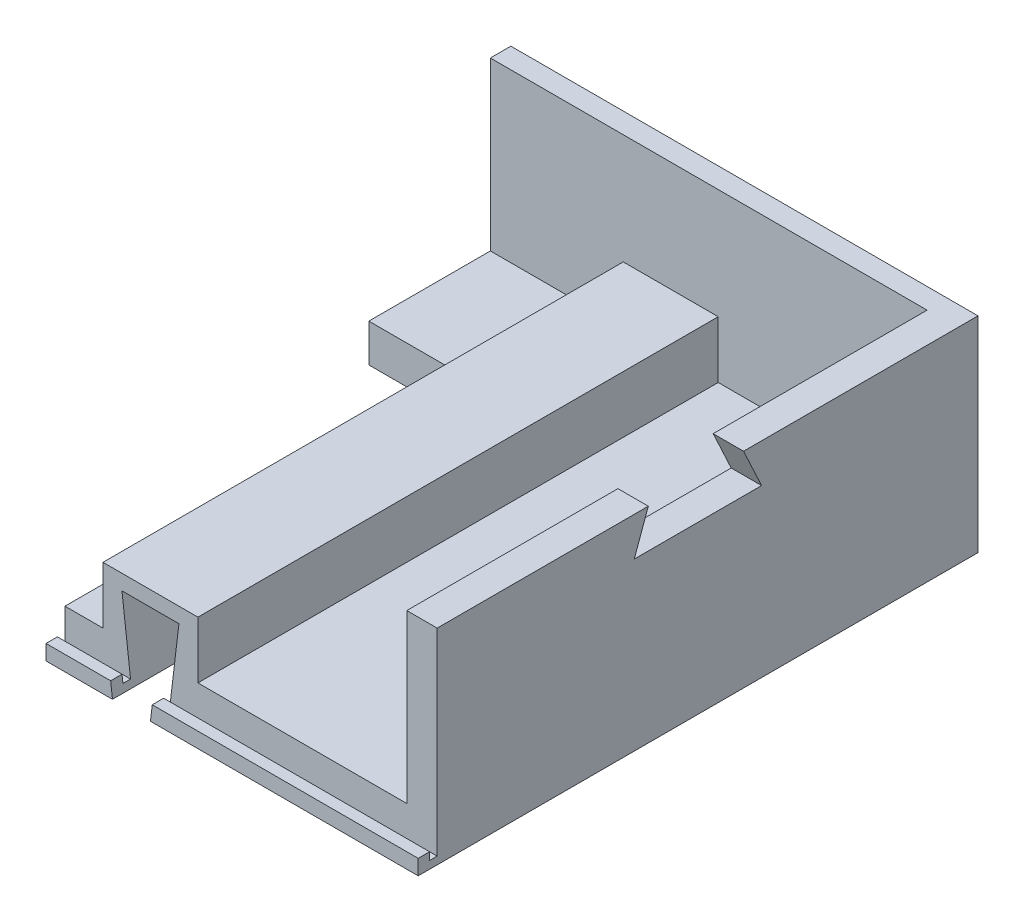
ISO-10303-21;
HEADER;
FILE_DESCRIPTION(('STEP AP214'),'2;1');
FILE_NAME('part.step','',(''),(''),'','','');
FILE_SCHEMA(('AUTOMOTIVE_DESIGN { 1 0 10303 214 1 1 1 1 }'));
ENDSEC;
DATA;
#1=APPLICATION_CONTEXT('core data for automotive mechanical design processes');
#2=APPLICATION_PROTOCOL_DEFINITION('international standard','automotive_design',2000,#1);
#3=PRODUCT_CONTEXT('',#1,'mechanical');
#4=PRODUCT('Part','Part','',(#3));
#5=PRODUCT_RELATED_PRODUCT_CATEGORY('part','',(#4));
#6=PRODUCT_DEFINITION_FORMATION('','',#4);
#7=PRODUCT_DEFINITION_CONTEXT('part definition',#1,'design');
#8=PRODUCT_DEFINITION('design','',#6,#7);
#9=PRODUCT_DEFINITION_SHAPE('','',#8);
#10=(LENGTH_UNIT() NAMED_UNIT(*) SI_UNIT(.MILLI.,.METRE.));
#11=(NAMED_UNIT(*) PLANE_ANGLE_UNIT() SI_UNIT($,.RADIAN.));
#12=(NAMED_UNIT(*) SI_UNIT($,.STERADIAN.) SOLID_ANGLE_UNIT());
#13=UNCERTAINTY_MEASURE_WITH_UNIT(LENGTH_MEASURE(1.E-05),#10,'distance_accuracy_value','');
#14=(GEOMETRIC_REPRESENTATION_CONTEXT(3) GLOBAL_UNCERTAINTY_ASSIGNED_CONTEXT((#13)) GLOBAL_UNIT_ASSIGNED_CONTEXT((#10,
#11,#12)) REPRESENTATION_CONTEXT('',''));
#15=CARTESIAN_POINT('',(0.,0.,0.));
#16=DIRECTION('',(0.,0.,1.));
#17=DIRECTION('',(1.,0.,0.));
#18=AXIS2_PLACEMENT_3D('',#15,#16,#17);
#19=CARTESIAN_POINT('',(-0.0100000000001627,-46.,90.919595482007));
#20=DIRECTION('',(0.,-1.,0.));
#21=DIRECTION('',(0.,0.,-1.));
#22=AXIS2_PLACEMENT_3D('',#19,#20,#21);
#23=PLANE('',#22);
#24=DIRECTION('',(0.,0.,1.));
#25=VECTOR('',#24,1.);
#26=CARTESIAN_POINT('',(115.,-46.,0.));
#27=LINE('',#26,#25);
#28=CARTESIAN_POINT('',(115.,-46.,14.4113737851326));
#29=VERTEX_POINT('',#28);
#30=CARTESIAN_POINT('',(115.,-46.,70.));
#31=VERTEX_POINT('',#30);
#32=EDGE_CURVE('E314',#29,#31,#27,.T.);
#33=ORIENTED_EDGE('',*,*,#32,.T.);
#34=DIRECTION('',(-1.,0.,0.));
#35=VECTOR('',#34,1.);
#36=CARTESIAN_POINT('',(123.,-46.,70.));
#37=LINE('',#36,#35);
#38=CARTESIAN_POINT('',(123.,-46.,70.));
#39=VERTEX_POINT('',#38);
#40=EDGE_CURVE('E304',#39,#31,#37,.T.);
#41=ORIENTED_EDGE('',*,*,#40,.F.);
#42=DIRECTION('',(0.,0.,1.));
#43=VECTOR('',#42,1.);
#44=CARTESIAN_POINT('',(123.,-46.,-313.));
#45=LINE('',#44,#43);
#46=CARTESIAN_POINT('',(123.,-46.,14.4113737851326));
#47=VERTEX_POINT('',#46);
#48=EDGE_CURVE('E51',#47,#39,#45,.T.);
#49=ORIENTED_EDGE('',*,*,#48,.F.);
#50=DIRECTION('',(1.,0.,0.));
#51=VECTOR('',#50,1.);
#52=CARTESIAN_POINT('',(-0.0100000000001627,-46.,14.4113737851326));
#53=LINE('',#52,#51);
#54=EDGE_CURVE('E11',#29,#47,#53,.T.);
#55=ORIENTED_EDGE('',*,*,#54,.F.);
#56=EDGE_LOOP('',(#33,#41,#49,#55));
#57=FACE_BOUND('',#56,.T.);
#58=ADVANCED_FACE('F34',(#57),#23,.F.);
#59=CARTESIAN_POINT('',(-0.0100000000001627,-46.,14.4113737851326));
#60=DIRECTION('',(0.,0.340441083604863,0.940265849956249));
#61=DIRECTION('',(0.,-0.940265849956249,0.340441083604863));
#62=AXIS2_PLACEMENT_3D('',#59,#60,#61);
#63=PLANE('',#62);
#64=DIRECTION('',(0.,0.940265849956249,-0.340441083604863));
#65=VECTOR('',#64,1.);
#66=CARTESIAN_POINT('',(115.,-0.718251440133874,-1.98374207275064));
#67=LINE('',#66,#65);
#68=CARTESIAN_POINT('',(115.,-56.2075124770156,18.1071972681901));
#69=VERTEX_POINT('',#68);
#70=EDGE_CURVE('E324',#69,#29,#67,.T.);
#71=ORIENTED_EDGE('',*,*,#70,.T.);
#72=ORIENTED_EDGE('',*,*,#54,.T.);
#73=DIRECTION('',(0.,0.940265849956249,-0.340441083604863));
#74=VECTOR('',#73,1.);
#75=CARTESIAN_POINT('',(123.,106.547451582208,-40.8213242015313));
#76=LINE('',#75,#74);
#77=CARTESIAN_POINT('',(123.,-56.2075124770156,18.1071972681901));
#78=VERTEX_POINT('',#77);
#79=EDGE_CURVE('E57',#78,#47,#76,.T.);
#80=ORIENTED_EDGE('',*,*,#79,.F.);
#81=DIRECTION('',(1.,0.,0.));
#82=VECTOR('',#81,1.);
#83=CARTESIAN_POINT('',(-0.0100000000001627,-56.2075124770156,18.1071972681901));
#84=LINE('',#83,#82);
#85=EDGE_CURVE('E43',#69,#78,#84,.T.);
#86=ORIENTED_EDGE('',*,*,#85,.F.);
#87=EDGE_LOOP('',(#71,#72,#80,#86));
#88=FACE_BOUND('',#87,.T.);
#89=ADVANCED_FACE('F564',(#88),#63,.F.);
#90=CARTESIAN_POINT('',(-0.0100000000001627,-56.2075124770156,18.1071972681901));
#91=DIRECTION('',(0.,-1.,0.));
#92=DIRECTION('',(0.,0.,-1.));
#93=AXIS2_PLACEMENT_3D('',#90,#91,#92);
#94=PLANE('',#93);
#95=DIRECTION('',(0.,0.,1.));
#96=VECTOR('',#95,1.);
#97=CARTESIAN_POINT('',(115.,-56.2075124770156,0.));
#98=LINE('',#97,#96);
#99=CARTESIAN_POINT('',(115.,-56.2075124770156,-15.4192014709746));
#100=VERTEX_POINT('',#99);
#101=EDGE_CURVE('E326',#100,#69,#98,.T.);
#102=ORIENTED_EDGE('',*,*,#101,.T.);
#103=ORIENTED_EDGE('',*,*,#85,.T.);
#104=DIRECTION('',(0.,0.,1.));
#105=VECTOR('',#104,1.);
#106=CARTESIAN_POINT('',(123.,-56.2075124770156,-313.));
#107=LINE('',#106,#105);
#108=CARTESIAN_POINT('',(123.,-56.2075124770156,-15.4192014709746));
#109=VERTEX_POINT('',#108);
#110=EDGE_CURVE('E297',#109,#78,#107,.T.);
#111=ORIENTED_EDGE('',*,*,#110,.F.);
#112=DIRECTION('',(1.,0.,0.));
#113=VECTOR('',#112,1.);
#114=CARTESIAN_POINT('',(-0.0100000000001627,-56.2075124770156,-15.4192014709746));
#115=LINE('',#114,#113);
#116=EDGE_CURVE('E308',#100,#109,#115,.T.);
#117=ORIENTED_EDGE('',*,*,#116,.F.);
#118=EDGE_LOOP('',(#102,#103,#111,#117));
#119=FACE_BOUND('',#118,.T.);
#120=ADVANCED_FACE('F339',(#119),#94,.F.);
#121=CARTESIAN_POINT('',(-0.0100000000001627,-56.2075124770156,-15.4192014709746));
#122=DIRECTION('',(0.,0.422029580157873,-0.906582061079839));
#123=DIRECTION('',(0.,0.906582061079839,0.422029580157873));
#124=AXIS2_PLACEMENT_3D('',#121,#122,#123);
#125=PLANE('',#124);
#126=DIRECTION('',(0.,-0.906582061079839,-0.422029580157873));
#127=VECTOR('',#126,1.);
#128=CARTESIAN_POINT('',(115.,-4.11160691233821,8.83234077465208));
#129=LINE('',#128,#127);
#130=CARTESIAN_POINT('',(115.,-46.,-10.6674284213292));
#131=VERTEX_POINT('',#130);
#132=EDGE_CURVE('E38',#131,#100,#129,.T.);
#133=ORIENTED_EDGE('',*,*,#132,.T.);
#134=ORIENTED_EDGE('',*,*,#116,.T.);
#135=DIRECTION('',(0.,-0.906582061079839,-0.422029580157873));
#136=VECTOR('',#135,1.);
#137=CARTESIAN_POINT('',(123.,-117.29167043543,-43.8549301757546));
#138=LINE('',#137,#136);
#139=CARTESIAN_POINT('',(123.,-46.,-10.6674284213292));
#140=VERTEX_POINT('',#139);
#141=EDGE_CURVE('E299',#140,#109,#138,.T.);
#142=ORIENTED_EDGE('',*,*,#141,.F.);
#143=DIRECTION('',(1.,0.,0.));
#144=VECTOR('',#143,1.);
#145=CARTESIAN_POINT('',(-0.0100000000001627,-46.,-10.6674284213292));
#146=LINE('',#145,#144);
#147=EDGE_CURVE('E311',#131,#140,#146,.T.);
#148=ORIENTED_EDGE('',*,*,#147,.F.);
#149=EDGE_LOOP('',(#133,#134,#142,#148));
#150=FACE_BOUND('',#149,.T.);
#151=ADVANCED_FACE('F333',(#150),#125,.F.);
#152=CARTESIAN_POINT('',(-0.0100000000001627,-46.,-10.6674284213292));
#153=DIRECTION('',(0.,-1.,0.));
#154=DIRECTION('',(0.,0.,-1.));
#155=AXIS2_PLACEMENT_3D('',#152,#153,#154);
#156=PLANE('',#155);
#157=DIRECTION('',(0.,0.,1.));
#158=VECTOR('',#157,1.);
#159=CARTESIAN_POINT('',(115.,-46.,0.));
#160=LINE('',#159,#158);
#161=CARTESIAN_POINT('',(115.,-46.,-67.));
#162=VERTEX_POINT('',#161);
#163=EDGE_CURVE('E316',#162,#131,#160,.T.);
#164=ORIENTED_EDGE('',*,*,#163,.T.);
#165=ORIENTED_EDGE('',*,*,#147,.T.);
#166=DIRECTION('',(0.,0.,1.));
#167=VECTOR('',#166,1.);
#168=CARTESIAN_POINT('',(123.,-46.,-313.));
#169=LINE('',#168,#167);
#170=CARTESIAN_POINT('',(123.,-46.,-72.4000000000001));
#171=VERTEX_POINT('',#170);
#172=EDGE_CURVE('E302',#171,#140,#169,.T.);
#173=ORIENTED_EDGE('',*,*,#172,.F.);
#174=DIRECTION('',(1.,0.,0.));
#175=VECTOR('',#174,1.);
#176=CARTESIAN_POINT('',(-265.,-46.,-72.4000000000001));
#177=LINE('',#176,#175);
#178=CARTESIAN_POINT('',(0.,-46.,-72.4000000000001));
#179=VERTEX_POINT('',#178);
#180=EDGE_CURVE('E292',#179,#171,#177,.T.);
#181=ORIENTED_EDGE('',*,*,#180,.F.);
#182=DIRECTION('',(0.,0.,1.));
#183=VECTOR('',#182,1.);
#184=CARTESIAN_POINT('',(0.,-46.,-81.3471847648053));
#185=LINE('',#184,#183);
#186=CARTESIAN_POINT('',(0.,-46.,-67.));
#187=VERTEX_POINT('',#186);
#188=EDGE_CURVE('E255',#179,#187,#185,.T.);
#189=ORIENTED_EDGE('',*,*,#188,.T.);
#190=DIRECTION('',(-1.,0.,0.));
#191=VECTOR('',#190,1.);
#192=CARTESIAN_POINT('',(-125.,-46.,-67.));
#193=LINE('',#192,#191);
#194=EDGE_CURVE('E317',#162,#187,#193,.T.);
#195=ORIENTED_EDGE('',*,*,#194,.F.);
#196=EDGE_LOOP('',(#164,#165,#173,#181,#189,#195));
#197=FACE_BOUND('',#196,.T.);
#198=ADVANCED_FACE('F36',(#197),#156,.F.);
#199=CARTESIAN_POINT('',(123.,0.,72.));
#200=DIRECTION('',(0.,0.,-1.));
#201=DIRECTION('',(-1.,0.,0.));
#202=AXIS2_PLACEMENT_3D('',#199,#200,#201);
#203=PLANE('',#202);
#204=DIRECTION('',(0.118212889785112,-0.992988274194944,0.));
#205=VECTOR('',#204,1.);
#206=CARTESIAN_POINT('',(30.1676914477361,3.5913918390162,72.));
#207=LINE('',#206,#205);
#208=CARTESIAN_POINT('',(42.0238095238095,-96.,72.));
#209=VERTEX_POINT('',#208);
#210=CARTESIAN_POINT('',(42.2619047619047,-98.,72.));
#211=VERTEX_POINT('',#210);
#212=EDGE_CURVE('E430',#209,#211,#207,.T.);
#213=ORIENTED_EDGE('',*,*,#212,.T.);
#214=DIRECTION('',(-1.,0.,0.));
#215=VECTOR('',#214,1.);
#216=CARTESIAN_POINT('',(123.,-98.,72.));
#217=LINE('',#216,#215);
#218=CARTESIAN_POINT('',(25.,-98.,72.));
#219=VERTEX_POINT('',#218);
#220=EDGE_CURVE('E503',#211,#219,#217,.T.);
#221=ORIENTED_EDGE('',*,*,#220,.T.);
#222=DIRECTION('',(0.,1.,0.));
#223=VECTOR('',#222,1.);
#224=CARTESIAN_POINT('',(25.,-26.0000000000001,72.));
#225=LINE('',#224,#223);
#226=CARTESIAN_POINT('',(25.,-96.,72.));
#227=VERTEX_POINT('',#226);
#228=EDGE_CURVE('E432',#219,#227,#225,.T.);
#229=ORIENTED_EDGE('',*,*,#228,.T.);
#230=DIRECTION('',(-1.,0.,0.));
#231=VECTOR('',#230,1.);
#232=CARTESIAN_POINT('',(123.,-96.,72.));
#233=LINE('',#232,#231);
#234=EDGE_CURVE('E477',#209,#227,#233,.T.);
#235=ORIENTED_EDGE('',*,*,#234,.F.);
#236=EDGE_LOOP('',(#213,#221,#229,#235));
#237=FACE_BOUND('',#236,.T.);
#238=ADVANCED_FACE('F579',(#237),#203,.T.);
#239=CARTESIAN_POINT('',(123.,-96.,0.));
#240=DIRECTION('',(0.,1.,0.));
#241=DIRECTION('',(-1.,0.,0.));
#242=AXIS2_PLACEMENT_3D('',#239,#240,#241);
#243=PLANE('',#242);
#244=DIRECTION('',(0.,0.,-1.));
#245=VECTOR('',#244,1.);
#246=CARTESIAN_POINT('',(42.0238095238095,-96.,-67.));
#247=LINE('',#246,#245);
#248=CARTESIAN_POINT('',(42.0238095238095,-96.,75.));
#249=VERTEX_POINT('',#248);
#250=EDGE_CURVE('E468',#249,#209,#247,.T.);
#251=ORIENTED_EDGE('',*,*,#250,.T.);
#252=ORIENTED_EDGE('',*,*,#234,.T.);
#253=DIRECTION('',(0.,0.,1.));
#254=VECTOR('',#253,1.);
#255=CARTESIAN_POINT('',(25.,-96.,35.));
#256=LINE('',#255,#254);
#257=CARTESIAN_POINT('',(25.,-96.,75.));
#258=VERTEX_POINT('',#257);
#259=EDGE_CURVE('E470',#227,#258,#256,.T.);
#260=ORIENTED_EDGE('',*,*,#259,.T.);
#261=DIRECTION('',(-1.,0.,0.));
#262=VECTOR('',#261,1.);
#263=CARTESIAN_POINT('',(123.,-96.,75.));
#264=LINE('',#263,#262);
#265=EDGE_CURVE('E495',#249,#258,#264,.T.);
#266=ORIENTED_EDGE('',*,*,#265,.F.);
#267=EDGE_LOOP('',(#251,#252,#260,#266));
#268=FACE_BOUND('',#267,.T.);
#269=ADVANCED_FACE('F583',(#268),#243,.T.);
#270=CARTESIAN_POINT('',(-25.,-26.0000000000001,-35.));
#271=DIRECTION('',(0.,0.,-1.));
#272=DIRECTION('',(-1.,0.,0.));
#273=AXIS2_PLACEMENT_3D('',#270,#271,#272);
#274=PLANE('',#273);
#275=DIRECTION('',(0.,1.,0.));
#276=VECTOR('',#275,1.);
#277=CARTESIAN_POINT('',(21.4254854809113,-26.0000000000001,-35.));
#278=LINE('',#277,#276);
#279=CARTESIAN_POINT('',(21.4254854809113,-100.,-35.));
#280=VERTEX_POINT('',#279);
#281=CARTESIAN_POINT('',(21.4254854809113,-90.,-35.));
#282=VERTEX_POINT('',#281);
#283=EDGE_CURVE('E486',#280,#282,#278,.T.);
#284=ORIENTED_EDGE('',*,*,#283,.F.);
#285=DIRECTION('',(1.,0.,0.));
#286=VECTOR('',#285,1.);
#287=CARTESIAN_POINT('',(-25.,-100.,-35.));
#288=LINE('',#287,#286);
#289=CARTESIAN_POINT('',(25.,-100.,-35.));
#290=VERTEX_POINT('',#289);
#291=EDGE_CURVE('E421',#280,#290,#288,.T.);
#292=ORIENTED_EDGE('',*,*,#291,.T.);
#293=DIRECTION('',(0.,-1.,0.));
#294=VECTOR('',#293,1.);
#295=CARTESIAN_POINT('',(25.,-26.0000000000001,-35.));
#296=LINE('',#295,#294);
#297=CARTESIAN_POINT('',(25.,-90.,-35.));
#298=VERTEX_POINT('',#297);
#299=EDGE_CURVE('E414',#298,#290,#296,.T.);
#300=ORIENTED_EDGE('',*,*,#299,.F.);
#301=DIRECTION('',(1.,0.,0.));
#302=VECTOR('',#301,1.);
#303=CARTESIAN_POINT('',(0.,-90.,-35.));
#304=LINE('',#303,#302);
#305=EDGE_CURVE('E513',#282,#298,#304,.T.);
#306=ORIENTED_EDGE('',*,*,#305,.F.);
#307=EDGE_LOOP('',(#284,#292,#300,#306));
#308=FACE_BOUND('',#307,.T.);
#309=ADVANCED_FACE('F544',(#308),#274,.F.);
#310=CARTESIAN_POINT('',(-125.,8.,75.));
#311=DIRECTION('',(0.,0.,-1.));
#312=DIRECTION('',(-1.,0.,0.));
#313=AXIS2_PLACEMENT_3D('',#310,#311,#312);
#314=PLANE('',#313);
#315=ORIENTED_EDGE('',*,*,#265,.T.);
#316=DIRECTION('',(0.,-1.,0.));
#317=VECTOR('',#316,1.);
#318=CARTESIAN_POINT('',(25.,-76.0000000000001,75.));
#319=LINE('',#318,#317);
#320=CARTESIAN_POINT('',(25.,-100.,75.));
#321=VERTEX_POINT('',#320);
#322=EDGE_CURVE('E425',#258,#321,#319,.T.);
#323=ORIENTED_EDGE('',*,*,#322,.T.);
#324=DIRECTION('',(1.,0.,0.));
#325=VECTOR('',#324,1.);
#326=CARTESIAN_POINT('',(0.,-100.,75.));
#327=LINE('',#326,#325);
#328=CARTESIAN_POINT('',(42.4999999999999,-100.,75.));
#329=VERTEX_POINT('',#328);
#330=EDGE_CURVE('E394',#321,#329,#327,.T.);
#331=ORIENTED_EDGE('',*,*,#330,.T.);
#332=DIRECTION('',(0.118212889785112,-0.992988274194944,0.));
#333=VECTOR('',#332,1.);
#334=CARTESIAN_POINT('',(30.1676914477361,3.5913918390162,75.));
#335=LINE('',#334,#333);
#336=EDGE_CURVE('E392',#249,#329,#335,.T.);
#337=ORIENTED_EDGE('',*,*,#336,.F.);
#338=EDGE_LOOP('',(#315,#323,#331,#337));
#339=FACE_BOUND('',#338,.T.);
#340=ADVANCED_FACE('F559',(#339),#314,.F.);
#341=CARTESIAN_POINT('',(-125.,-100.,-67.));
#342=DIRECTION('',(0.,0.,-1.));
#343=DIRECTION('',(-1.,0.,0.));
#344=AXIS2_PLACEMENT_3D('',#341,#342,#343);
#345=PLANE('',#344);
#346=DIRECTION('',(-1.,0.,0.));
#347=VECTOR('',#346,1.);
#348=CARTESIAN_POINT('',(-125.,-100.,-67.));
#349=LINE('',#348,#347);
#350=CARTESIAN_POINT('',(52.4999999999999,-100.,-67.));
#351=VERTEX_POINT('',#350);
#352=CARTESIAN_POINT('',(42.4999999999999,-100.,-67.));
#353=VERTEX_POINT('',#352);
#354=EDGE_CURVE('E355',#351,#353,#349,.T.);
#355=ORIENTED_EDGE('',*,*,#354,.F.);
#356=DIRECTION('',(-0.118212889785112,-0.992988274194944,0.));
#357=VECTOR('',#356,1.);
#358=CARTESIAN_POINT('',(63.5047512576858,-7.56008943543879,-67.));
#359=LINE('',#358,#357);
#360=CARTESIAN_POINT('',(54.9999999999999,-79.,-67.));
#361=VERTEX_POINT('',#360);
#362=EDGE_CURVE('E369',#361,#351,#359,.T.);
#363=ORIENTED_EDGE('',*,*,#362,.F.);
#364=DIRECTION('',(1.,0.,0.));
#365=VECTOR('',#364,1.);
#366=CARTESIAN_POINT('',(0.,-79.,-67.));
#367=LINE('',#366,#365);
#368=CARTESIAN_POINT('',(39.9999999999999,-79.,-67.));
#369=VERTEX_POINT('',#368);
#370=EDGE_CURVE('E397',#369,#361,#367,.T.);
#371=ORIENTED_EDGE('',*,*,#370,.F.);
#372=DIRECTION('',(0.118212889785112,-0.992988274194944,0.));
#373=VECTOR('',#372,1.);
#374=CARTESIAN_POINT('',(30.1676914477361,3.5913918390162,-67.));
#375=LINE('',#374,#373);
#376=EDGE_CURVE('E400',#369,#353,#375,.T.);
#377=ORIENTED_EDGE('',*,*,#376,.T.);
#378=EDGE_LOOP('',(#355,#363,#371,#377));
#379=FACE_BOUND('',#378,.T.);
#380=ADVANCED_FACE('F551',(#379),#345,.F.);
#381=CARTESIAN_POINT('',(21.4254854809113,-100.01,-35.2331156649871));
#382=DIRECTION('',(0.258783129312768,0.,0.965935449180271));
#383=DIRECTION('',(0.965935449180271,0.,-0.258783129312768));
#384=AXIS2_PLACEMENT_3D('',#381,#382,#383);
#385=PLANE('',#384);
#386=DIRECTION('',(0.,-1.,0.));
#387=VECTOR('',#386,1.);
#388=CARTESIAN_POINT('',(20.5553565618884,-26.0000000000001,-35.));
#389=LINE('',#388,#387);
#390=CARTESIAN_POINT('',(20.5553565618884,-90.,-35.));
#391=VERTEX_POINT('',#390);
#392=CARTESIAN_POINT('',(20.5553565618884,-100.,-35.));
#393=VERTEX_POINT('',#392);
#394=EDGE_CURVE('E489',#391,#393,#389,.T.);
#395=ORIENTED_EDGE('',*,*,#394,.T.);
#396=DIRECTION('',(0.965935449180271,0.,-0.258783129312768));
#397=VECTOR('',#396,1.);
#398=CARTESIAN_POINT('',(-7.3723072670786,-100.,-27.5179179973275));
#399=LINE('',#398,#397);
#400=CARTESIAN_POINT('',(21.4254854809113,-100.,-35.2331156649871));
#401=VERTEX_POINT('',#400);
#402=EDGE_CURVE('E274',#393,#401,#399,.T.);
#403=ORIENTED_EDGE('',*,*,#402,.T.);
#404=DIRECTION('',(0.,1.,0.));
#405=VECTOR('',#404,1.);
#406=CARTESIAN_POINT('',(21.4254854809113,-100.01,-35.2331156649871));
#407=LINE('',#406,#405);
#408=CARTESIAN_POINT('',(21.4254854809113,-90.,-35.2331156649871));
#409=VERTEX_POINT('',#408);
#410=EDGE_CURVE('E290',#401,#409,#407,.T.);
#411=ORIENTED_EDGE('',*,*,#410,.T.);
#412=DIRECTION('',(-0.965935449180271,0.,0.258783129312768));
#413=VECTOR('',#412,1.);
#414=CARTESIAN_POINT('',(9.37553521587272,-90.,-32.0048214344604));
#415=LINE('',#414,#413);
#416=EDGE_CURVE('E281',#409,#391,#415,.T.);
#417=ORIENTED_EDGE('',*,*,#416,.T.);
#418=EDGE_LOOP('',(#395,#403,#411,#417));
#419=FACE_BOUND('',#418,.T.);
#420=ADVANCED_FACE('F549',(#419),#385,.T.);
#421=CARTESIAN_POINT('',(21.4254854809113,-100.01,-35.2331156649871));
#422=DIRECTION('',(-1.,0.,0.));
#423=DIRECTION('',(0.,0.,1.));
#424=AXIS2_PLACEMENT_3D('',#421,#422,#423);
#425=PLANE('',#424);
#426=ORIENTED_EDGE('',*,*,#410,.F.);
#427=DIRECTION('',(0.,0.,1.));
#428=VECTOR('',#427,1.);
#429=CARTESIAN_POINT('',(21.4254854809113,-100.,0.));
#430=LINE('',#429,#428);
#431=EDGE_CURVE('E278',#401,#280,#430,.T.);
#432=ORIENTED_EDGE('',*,*,#431,.T.);
#433=ORIENTED_EDGE('',*,*,#283,.T.);
#434=DIRECTION('',(0.,0.,-1.));
#435=VECTOR('',#434,1.);
#436=CARTESIAN_POINT('',(21.4254854809113,-90.,-67.));
#437=LINE('',#436,#435);
#438=EDGE_CURVE('E275',#282,#409,#437,.T.);
#439=ORIENTED_EDGE('',*,*,#438,.T.);
#440=EDGE_LOOP('',(#426,#432,#433,#439));
#441=FACE_BOUND('',#440,.T.);
#442=ADVANCED_FACE('F547',(#441),#425,.T.);
#443=ORIENTED_EDGE('',*,*,#394,.F.);
#444=CARTESIAN_POINT('',(0.,-90.,-35.));
#445=VERTEX_POINT('',#444);
#446=EDGE_CURVE('E512',#445,#391,#304,.T.);
#447=ORIENTED_EDGE('',*,*,#446,.F.);
#448=DIRECTION('',(0.,1.,0.));
#449=VECTOR('',#448,1.);
#450=CARTESIAN_POINT('',(0.,-26.0000000000001,-35.));
#451=LINE('',#450,#449);
#452=CARTESIAN_POINT('',(0.,-100.,-35.));
#453=VERTEX_POINT('',#452);
#454=EDGE_CURVE('E258',#453,#445,#451,.T.);
#455=ORIENTED_EDGE('',*,*,#454,.F.);
#456=EDGE_CURVE('E273',#453,#393,#288,.T.);
#457=ORIENTED_EDGE('',*,*,#456,.T.);
#458=EDGE_LOOP('',(#443,#447,#455,#457));
#459=FACE_BOUND('',#458,.T.);
#460=ADVANCED_FACE('F517',(#459),#274,.F.);
#461=CARTESIAN_POINT('',(63.5047512576858,-7.56008943543879,-67.));
#462=DIRECTION('',(-0.992988274194944,0.118212889785112,0.));
#463=DIRECTION('',(-0.118212889785112,-0.992988274194944,0.));
#464=AXIS2_PLACEMENT_3D('',#461,#462,#463);
#465=PLANE('',#464);
#466=DIRECTION('',(-0.118212889785112,-0.992988274194944,0.));
#467=VECTOR('',#466,1.);
#468=CARTESIAN_POINT('',(63.5047512576858,-7.56008943543877,70.));
#469=LINE('',#468,#467);
#470=CARTESIAN_POINT('',(54.9999999999999,-79.,70.));
#471=VERTEX_POINT('',#470);
#472=CARTESIAN_POINT('',(52.7380952380952,-98.,70.));
#473=VERTEX_POINT('',#472);
#474=EDGE_CURVE('E441',#471,#473,#469,.T.);
#475=ORIENTED_EDGE('',*,*,#474,.F.);
#476=DIRECTION('',(0.,0.,1.));
#477=VECTOR('',#476,1.);
#478=CARTESIAN_POINT('',(54.9999999999999,-79.,-67.));
#479=LINE('',#478,#477);
#480=EDGE_CURVE('E385',#361,#471,#479,.T.);
#481=ORIENTED_EDGE('',*,*,#480,.F.);
#482=ORIENTED_EDGE('',*,*,#362,.T.);
#483=DIRECTION('',(0.,0.,1.));
#484=VECTOR('',#483,1.);
#485=CARTESIAN_POINT('',(52.4999999999999,-100.,-67.));
#486=LINE('',#485,#484);
#487=CARTESIAN_POINT('',(52.4999999999999,-100.,75.));
#488=VERTEX_POINT('',#487);
#489=EDGE_CURVE('E358',#351,#488,#486,.T.);
#490=ORIENTED_EDGE('',*,*,#489,.T.);
#491=DIRECTION('',(-0.118212889785112,-0.992988274194944,0.));
#492=VECTOR('',#491,1.);
#493=CARTESIAN_POINT('',(63.5047512576858,-7.56008943543879,75.));
#494=LINE('',#493,#492);
#495=CARTESIAN_POINT('',(52.9761904761904,-96.,75.));
#496=VERTEX_POINT('',#495);
#497=EDGE_CURVE('E390',#496,#488,#494,.T.);
#498=ORIENTED_EDGE('',*,*,#497,.F.);
#499=DIRECTION('',(0.,0.,-1.));
#500=VECTOR('',#499,1.);
#501=CARTESIAN_POINT('',(52.9761904761904,-96.,-67.));
#502=LINE('',#501,#500);
#503=CARTESIAN_POINT('',(52.9761904761904,-96.,72.));
#504=VERTEX_POINT('',#503);
#505=EDGE_CURVE('E465',#496,#504,#502,.T.);
#506=ORIENTED_EDGE('',*,*,#505,.T.);
#507=DIRECTION('',(-0.118212889785112,-0.992988274194944,0.));
#508=VECTOR('',#507,1.);
#509=CARTESIAN_POINT('',(63.5047512576858,-7.56008943543879,72.));
#510=LINE('',#509,#508);
#511=CARTESIAN_POINT('',(52.7380952380952,-98.,72.));
#512=VERTEX_POINT('',#511);
#513=EDGE_CURVE('E427',#504,#512,#510,.T.);
#514=ORIENTED_EDGE('',*,*,#513,.T.);
#515=DIRECTION('',(0.,0.,-1.));
#516=VECTOR('',#515,1.);
#517=CARTESIAN_POINT('',(52.7380952380952,-98.,-67.));
#518=LINE('',#517,#516);
#519=EDGE_CURVE('E434',#512,#473,#518,.T.);
#520=ORIENTED_EDGE('',*,*,#519,.T.);
#521=EDGE_LOOP('',(#475,#481,#482,#490,#498,#506,#514,#520));
#522=FACE_BOUND('',#521,.T.);
#523=ADVANCED_FACE('F615',(#522),#465,.T.);
#524=CARTESIAN_POINT('',(0.,-79.,-67.));
#525=DIRECTION('',(0.,-1.,0.));
#526=DIRECTION('',(0.,0.,-1.));
#527=AXIS2_PLACEMENT_3D('',#524,#525,#526);
#528=PLANE('',#527);
#529=DIRECTION('',(1.,0.,0.));
#530=VECTOR('',#529,1.);
#531=CARTESIAN_POINT('',(0.,-79.,70.));
#532=LINE('',#531,#530);
#533=CARTESIAN_POINT('',(39.9999999999999,-78.9999999999999,70.));
#534=VERTEX_POINT('',#533);
#535=EDGE_CURVE('E443',#534,#471,#532,.T.);
#536=ORIENTED_EDGE('',*,*,#535,.F.);
#537=DIRECTION('',(0.,0.,1.));
#538=VECTOR('',#537,1.);
#539=CARTESIAN_POINT('',(39.9999999999999,-79.,-67.));
#540=LINE('',#539,#538);
#541=EDGE_CURVE('E382',#369,#534,#540,.T.);
#542=ORIENTED_EDGE('',*,*,#541,.F.);
#543=ORIENTED_EDGE('',*,*,#370,.T.);
#544=ORIENTED_EDGE('',*,*,#480,.T.);
#545=EDGE_LOOP('',(#536,#542,#543,#544));
#546=FACE_BOUND('',#545,.T.);
#547=ADVANCED_FACE('F618',(#546),#528,.T.);
#548=CARTESIAN_POINT('',(30.1676914477361,3.5913918390162,-67.));
#549=DIRECTION('',(-0.992988274194944,-0.118212889785112,0.));
#550=DIRECTION('',(0.118212889785112,-0.992988274194944,0.));
#551=AXIS2_PLACEMENT_3D('',#548,#549,#550);
#552=PLANE('',#551);
#553=ORIENTED_EDGE('',*,*,#541,.T.);
#554=DIRECTION('',(0.118212889785112,-0.992988274194944,0.));
#555=VECTOR('',#554,1.);
#556=CARTESIAN_POINT('',(30.1676914477361,3.59139183901622,70.));
#557=LINE('',#556,#555);
#558=CARTESIAN_POINT('',(42.2619047619047,-98.,70.));
#559=VERTEX_POINT('',#558);
#560=EDGE_CURVE('E445',#534,#559,#557,.T.);
#561=ORIENTED_EDGE('',*,*,#560,.T.);
#562=DIRECTION('',(0.,0.,-1.));
#563=VECTOR('',#562,1.);
#564=CARTESIAN_POINT('',(42.2619047619047,-98.,-67.));
#565=LINE('',#564,#563);
#566=EDGE_CURVE('E437',#211,#559,#565,.T.);
#567=ORIENTED_EDGE('',*,*,#566,.F.);
#568=ORIENTED_EDGE('',*,*,#212,.F.);
#569=ORIENTED_EDGE('',*,*,#250,.F.);
#570=ORIENTED_EDGE('',*,*,#336,.T.);
#571=DIRECTION('',(0.,0.,1.));
#572=VECTOR('',#571,1.);
#573=CARTESIAN_POINT('',(42.4999999999999,-100.,-67.));
#574=LINE('',#573,#572);
#575=EDGE_CURVE('E379',#353,#329,#574,.T.);
#576=ORIENTED_EDGE('',*,*,#575,.F.);
#577=ORIENTED_EDGE('',*,*,#376,.F.);
#578=EDGE_LOOP('',(#553,#561,#567,#568,#569,#570,#576,#577));
#579=FACE_BOUND('',#578,.T.);
#580=ADVANCED_FACE('F622',(#579),#552,.F.);
#581=CARTESIAN_POINT('',(123.,-98.,0.));
#582=DIRECTION('',(0.,1.,0.));
#583=DIRECTION('',(-1.,0.,0.));
#584=AXIS2_PLACEMENT_3D('',#581,#582,#583);
#585=PLANE('',#584);
#586=ORIENTED_EDGE('',*,*,#566,.T.);
#587=DIRECTION('',(-1.,0.,0.));
#588=VECTOR('',#587,1.);
#589=CARTESIAN_POINT('',(123.,-98.,70.));
#590=LINE('',#589,#588);
#591=CARTESIAN_POINT('',(25.,-98.,70.));
#592=VERTEX_POINT('',#591);
#593=EDGE_CURVE('E499',#559,#592,#590,.T.);
#594=ORIENTED_EDGE('',*,*,#593,.T.);
#595=DIRECTION('',(0.,0.,1.));
#596=VECTOR('',#595,1.);
#597=CARTESIAN_POINT('',(25.,-98.,35.));
#598=LINE('',#597,#596);
#599=EDGE_CURVE('E439',#592,#219,#598,.T.);
#600=ORIENTED_EDGE('',*,*,#599,.T.);
#601=ORIENTED_EDGE('',*,*,#220,.F.);
#602=EDGE_LOOP('',(#586,#594,#600,#601));
#603=FACE_BOUND('',#602,.T.);
#604=ADVANCED_FACE('F614',(#603),#585,.T.);
#605=CARTESIAN_POINT('',(25.,-26.0000000000001,35.));
#606=DIRECTION('',(1.,0.,0.));
#607=DIRECTION('',(0.,0.,-1.));
#608=AXIS2_PLACEMENT_3D('',#605,#606,#607);
#609=PLANE('',#608);
#610=ORIENTED_EDGE('',*,*,#599,.F.);
#611=DIRECTION('',(0.,1.,0.));
#612=VECTOR('',#611,1.);
#613=CARTESIAN_POINT('',(25.,-26.0000000000001,70.));
#614=LINE('',#613,#612);
#615=CARTESIAN_POINT('',(25.,-90.,70.));
#616=VERTEX_POINT('',#615);
#617=EDGE_CURVE('E462',#592,#616,#614,.T.);
#618=ORIENTED_EDGE('',*,*,#617,.T.);
#619=DIRECTION('',(0.,0.,1.));
#620=VECTOR('',#619,1.);
#621=CARTESIAN_POINT('',(25.,-90.,-67.));
#622=LINE('',#621,#620);
#623=EDGE_CURVE('E289',#298,#616,#622,.T.);
#624=ORIENTED_EDGE('',*,*,#623,.F.);
#625=ORIENTED_EDGE('',*,*,#299,.T.);
#626=DIRECTION('',(0.,0.,1.));
#627=VECTOR('',#626,1.);
#628=CARTESIAN_POINT('',(25.,-100.,35.));
#629=LINE('',#628,#627);
#630=EDGE_CURVE('E417',#290,#321,#629,.T.);
#631=ORIENTED_EDGE('',*,*,#630,.T.);
#632=ORIENTED_EDGE('',*,*,#322,.F.);
#633=ORIENTED_EDGE('',*,*,#259,.F.);
#634=ORIENTED_EDGE('',*,*,#228,.F.);
#635=EDGE_LOOP('',(#610,#618,#624,#625,#631,#632,#633,#634));
#636=FACE_BOUND('',#635,.T.);
#637=ADVANCED_FACE('F542',(#636),#609,.F.);
#638=CARTESIAN_POINT('',(0.,-90.,-67.));
#639=DIRECTION('',(0.,-1.,0.));
#640=DIRECTION('',(1.,0.,0.));
#641=AXIS2_PLACEMENT_3D('',#638,#639,#640);
#642=PLANE('',#641);
#643=ORIENTED_EDGE('',*,*,#438,.F.);
#644=ORIENTED_EDGE('',*,*,#305,.T.);
#645=ORIENTED_EDGE('',*,*,#623,.T.);
#646=DIRECTION('',(1.,0.,0.));
#647=VECTOR('',#646,1.);
#648=CARTESIAN_POINT('',(0.,-90.,70.));
#649=LINE('',#648,#647);
#650=CARTESIAN_POINT('',(35.,-90.,70.));
#651=VERTEX_POINT('',#650);
#652=EDGE_CURVE('E461',#616,#651,#649,.T.);
#653=ORIENTED_EDGE('',*,*,#652,.T.);
#654=DIRECTION('',(0.,0.,1.));
#655=VECTOR('',#654,1.);
#656=CARTESIAN_POINT('',(35.,-90.,-67.));
#657=LINE('',#656,#655);
#658=CARTESIAN_POINT('',(35.,-90.,-67.));
#659=VERTEX_POINT('',#658);
#660=EDGE_CURVE('E376',#659,#651,#657,.T.);
#661=ORIENTED_EDGE('',*,*,#660,.F.);
#662=DIRECTION('',(1.,0.,0.));
#663=VECTOR('',#662,1.);
#664=CARTESIAN_POINT('',(0.,-90.,-67.));
#665=LINE('',#664,#663);
#666=CARTESIAN_POINT('',(0.,-90.,-67.));
#667=VERTEX_POINT('',#666);
#668=EDGE_CURVE('E403',#667,#659,#665,.T.);
#669=ORIENTED_EDGE('',*,*,#668,.F.);
#670=DIRECTION('',(0.,0.,-1.));
#671=VECTOR('',#670,1.);
#672=CARTESIAN_POINT('',(0.,-90.,-67.));
#673=LINE('',#672,#671);
#674=EDGE_CURVE('E285',#445,#667,#673,.T.);
#675=ORIENTED_EDGE('',*,*,#674,.F.);
#676=ORIENTED_EDGE('',*,*,#446,.T.);
#677=ORIENTED_EDGE('',*,*,#416,.F.);
#678=EDGE_LOOP('',(#643,#644,#645,#653,#661,#669,#675,#676,#677));
#679=FACE_BOUND('',#678,.T.);
#680=ADVANCED_FACE('F521',(#679),#642,.F.);
#681=CARTESIAN_POINT('',(34.9999999999999,0.,-67.));
#682=DIRECTION('',(1.,0.,0.));
#683=DIRECTION('',(0.,1.,0.));
#684=AXIS2_PLACEMENT_3D('',#681,#682,#683);
#685=PLANE('',#684);
#686=ORIENTED_EDGE('',*,*,#660,.T.);
#687=DIRECTION('',(0.,1.,0.));
#688=VECTOR('',#687,1.);
#689=CARTESIAN_POINT('',(34.9999999999999,0.,70.));
#690=LINE('',#689,#688);
#691=CARTESIAN_POINT('',(34.9999999999999,-75.,70.));
#692=VERTEX_POINT('',#691);
#693=EDGE_CURVE('E458',#651,#692,#690,.T.);
#694=ORIENTED_EDGE('',*,*,#693,.T.);
#695=DIRECTION('',(0.,0.,1.));
#696=VECTOR('',#695,1.);
#697=CARTESIAN_POINT('',(34.9999999999999,-75.,-67.));
#698=LINE('',#697,#696);
#699=CARTESIAN_POINT('',(34.9999999999999,-75.,-67.));
#700=VERTEX_POINT('',#699);
#701=EDGE_CURVE('E373',#700,#692,#698,.T.);
#702=ORIENTED_EDGE('',*,*,#701,.F.);
#703=DIRECTION('',(0.,1.,0.));
#704=VECTOR('',#703,1.);
#705=CARTESIAN_POINT('',(34.9999999999999,0.,-67.));
#706=LINE('',#705,#704);
#707=EDGE_CURVE('E404',#659,#700,#706,.T.);
#708=ORIENTED_EDGE('',*,*,#707,.F.);
#709=EDGE_LOOP('',(#686,#694,#702,#708));
#710=FACE_BOUND('',#709,.T.);
#711=ADVANCED_FACE('F526',(#710),#685,.F.);
#712=CARTESIAN_POINT('',(0.,-75.,-67.));
#713=DIRECTION('',(0.,-1.,0.));
#714=DIRECTION('',(0.,0.,-1.));
#715=AXIS2_PLACEMENT_3D('',#712,#713,#714);
#716=PLANE('',#715);
#717=ORIENTED_EDGE('',*,*,#701,.T.);
#718=DIRECTION('',(1.,0.,0.));
#719=VECTOR('',#718,1.);
#720=CARTESIAN_POINT('',(0.,-75.,70.));
#721=LINE('',#720,#719);
#722=CARTESIAN_POINT('',(60.,-75.,70.));
#723=VERTEX_POINT('',#722);
#724=EDGE_CURVE('E455',#692,#723,#721,.T.);
#725=ORIENTED_EDGE('',*,*,#724,.T.);
#726=DIRECTION('',(0.,0.,1.));
#727=VECTOR('',#726,1.);
#728=CARTESIAN_POINT('',(60.,-75.,-67.));
#729=LINE('',#728,#727);
#730=CARTESIAN_POINT('',(60.,-75.,-67.));
#731=VERTEX_POINT('',#730);
#732=EDGE_CURVE('E370',#731,#723,#729,.T.);
#733=ORIENTED_EDGE('',*,*,#732,.F.);
#734=DIRECTION('',(1.,0.,0.));
#735=VECTOR('',#734,1.);
#736=CARTESIAN_POINT('',(0.,-75.,-67.));
#737=LINE('',#736,#735);
#738=EDGE_CURVE('E407',#700,#731,#737,.T.);
#739=ORIENTED_EDGE('',*,*,#738,.F.);
#740=EDGE_LOOP('',(#717,#725,#733,#739));
#741=FACE_BOUND('',#740,.T.);
#742=ADVANCED_FACE('F528',(#741),#716,.F.);
#743=CARTESIAN_POINT('',(60.,0.,-67.));
#744=DIRECTION('',(1.,0.,0.));
#745=DIRECTION('',(0.,0.,-1.));
#746=AXIS2_PLACEMENT_3D('',#743,#744,#745);
#747=PLANE('',#746);
#748=DIRECTION('',(0.,1.,0.));
#749=VECTOR('',#748,1.);
#750=CARTESIAN_POINT('',(60.,0.,70.));
#751=LINE('',#750,#749);
#752=CARTESIAN_POINT('',(60.,-90.,70.));
#753=VERTEX_POINT('',#752);
#754=EDGE_CURVE('E453',#753,#723,#751,.T.);
#755=ORIENTED_EDGE('',*,*,#754,.F.);
#756=DIRECTION('',(0.,0.,1.));
#757=VECTOR('',#756,1.);
#758=CARTESIAN_POINT('',(60.,-90.,-67.));
#759=LINE('',#758,#757);
#760=CARTESIAN_POINT('',(60.,-90.,-67.));
#761=VERTEX_POINT('',#760);
#762=EDGE_CURVE('E366',#761,#753,#759,.T.);
#763=ORIENTED_EDGE('',*,*,#762,.F.);
#764=DIRECTION('',(0.,1.,0.));
#765=VECTOR('',#764,1.);
#766=CARTESIAN_POINT('',(60.,0.,-67.));
#767=LINE('',#766,#765);
#768=EDGE_CURVE('E410',#761,#731,#767,.T.);
#769=ORIENTED_EDGE('',*,*,#768,.T.);
#770=ORIENTED_EDGE('',*,*,#732,.T.);
#771=EDGE_LOOP('',(#755,#763,#769,#770));
#772=FACE_BOUND('',#771,.T.);
#773=ADVANCED_FACE('F531',(#772),#747,.T.);
#774=CARTESIAN_POINT('',(0.,-89.9999999999999,-67.));
#775=DIRECTION('',(0.,-1.,0.));
#776=DIRECTION('',(1.,0.,0.));
#777=AXIS2_PLACEMENT_3D('',#774,#775,#776);
#778=PLANE('',#777);
#779=ORIENTED_EDGE('',*,*,#762,.T.);
#780=DIRECTION('',(1.,0.,0.));
#781=VECTOR('',#780,1.);
#782=CARTESIAN_POINT('',(0.,-89.9999999999999,70.));
#783=LINE('',#782,#781);
#784=CARTESIAN_POINT('',(115.,-90.,70.));
#785=VERTEX_POINT('',#784);
#786=EDGE_CURVE('E450',#753,#785,#783,.T.);
#787=ORIENTED_EDGE('',*,*,#786,.T.);
#788=DIRECTION('',(0.,0.,1.));
#789=VECTOR('',#788,1.);
#790=CARTESIAN_POINT('',(115.,-90.,0.));
#791=LINE('',#790,#789);
#792=CARTESIAN_POINT('',(115.,-90.,-67.));
#793=VERTEX_POINT('',#792);
#794=EDGE_CURVE('E361',#793,#785,#791,.T.);
#795=ORIENTED_EDGE('',*,*,#794,.F.);
#796=DIRECTION('',(1.,0.,0.));
#797=VECTOR('',#796,1.);
#798=CARTESIAN_POINT('',(0.,-89.9999999999999,-67.));
#799=LINE('',#798,#797);
#800=EDGE_CURVE('E352',#761,#793,#799,.T.);
#801=ORIENTED_EDGE('',*,*,#800,.F.);
#802=EDGE_LOOP('',(#779,#787,#795,#801));
#803=FACE_BOUND('',#802,.T.);
#804=ADVANCED_FACE('F533',(#803),#778,.F.);
#805=CARTESIAN_POINT('',(115.,0.,0.));
#806=DIRECTION('',(-1.,0.,0.));
#807=DIRECTION('',(0.,0.,1.));
#808=AXIS2_PLACEMENT_3D('',#805,#806,#807);
#809=PLANE('',#808);
#810=ORIENTED_EDGE('',*,*,#163,.F.);
#811=DIRECTION('',(0.,1.,0.));
#812=VECTOR('',#811,1.);
#813=CARTESIAN_POINT('',(115.,-100.,-67.));
#814=LINE('',#813,#812);
#815=EDGE_CURVE('E349',#793,#162,#814,.T.);
#816=ORIENTED_EDGE('',*,*,#815,.F.);
#817=ORIENTED_EDGE('',*,*,#794,.T.);
#818=DIRECTION('',(0.,-1.,0.));
#819=VECTOR('',#818,1.);
#820=CARTESIAN_POINT('',(115.,0.,70.));
#821=LINE('',#820,#819);
#822=EDGE_CURVE('E448',#31,#785,#821,.T.);
#823=ORIENTED_EDGE('',*,*,#822,.F.);
#824=ORIENTED_EDGE('',*,*,#32,.F.);
#825=ORIENTED_EDGE('',*,*,#70,.F.);
#826=ORIENTED_EDGE('',*,*,#101,.F.);
#827=ORIENTED_EDGE('',*,*,#132,.F.);
#828=EDGE_LOOP('',(#810,#816,#817,#823,#824,#825,#826,#827));
#829=FACE_BOUND('',#828,.T.);
#830=ADVANCED_FACE('F336',(#829),#809,.T.);
#831=CARTESIAN_POINT('',(123.,-96.,75.));
#832=VERTEX_POINT('',#831);
#833=EDGE_CURVE('E496',#832,#496,#264,.T.);
#834=ORIENTED_EDGE('',*,*,#833,.T.);
#835=ORIENTED_EDGE('',*,*,#497,.T.);
#836=DIRECTION('',(1.,0.,0.));
#837=VECTOR('',#836,1.);
#838=CARTESIAN_POINT('',(115.,-100.,74.9999999999999));
#839=LINE('',#838,#837);
#840=CARTESIAN_POINT('',(123.,-100.,74.9999999999999));
#841=VERTEX_POINT('',#840);
#842=EDGE_CURVE('E354',#488,#841,#839,.T.);
#843=ORIENTED_EDGE('',*,*,#842,.T.);
#844=DIRECTION('',(0.,-1.,0.));
#845=VECTOR('',#844,1.);
#846=CARTESIAN_POINT('',(123.,8.,75.));
#847=LINE('',#846,#845);
#848=EDGE_CURVE('E268',#832,#841,#847,.T.);
#849=ORIENTED_EDGE('',*,*,#848,.F.);
#850=EDGE_LOOP('',(#834,#835,#843,#849));
#851=FACE_BOUND('',#850,.T.);
#852=ADVANCED_FACE('F593',(#851),#314,.F.);
#853=ORIENTED_EDGE('',*,*,#833,.F.);
#854=DIRECTION('',(0.,0.,-1.));
#855=VECTOR('',#854,1.);
#856=CARTESIAN_POINT('',(123.,-96.,0.));
#857=LINE('',#856,#855);
#858=CARTESIAN_POINT('',(123.,-96.,72.));
#859=VERTEX_POINT('',#858);
#860=EDGE_CURVE('E479',#832,#859,#857,.T.);
#861=ORIENTED_EDGE('',*,*,#860,.T.);
#862=EDGE_CURVE('E492',#859,#504,#233,.T.);
#863=ORIENTED_EDGE('',*,*,#862,.T.);
#864=ORIENTED_EDGE('',*,*,#505,.F.);
#865=EDGE_LOOP('',(#853,#861,#863,#864));
#866=FACE_BOUND('',#865,.T.);
#867=ADVANCED_FACE('F639',(#866),#243,.T.);
#868=ORIENTED_EDGE('',*,*,#862,.F.);
#869=DIRECTION('',(0.,-1.,0.));
#870=VECTOR('',#869,1.);
#871=CARTESIAN_POINT('',(123.,0.,72.));
#872=LINE('',#871,#870);
#873=CARTESIAN_POINT('',(123.,-98.,72.));
#874=VERTEX_POINT('',#873);
#875=EDGE_CURVE('E293',#859,#874,#872,.T.);
#876=ORIENTED_EDGE('',*,*,#875,.T.);
#877=EDGE_CURVE('E472',#874,#512,#217,.T.);
#878=ORIENTED_EDGE('',*,*,#877,.T.);
#879=ORIENTED_EDGE('',*,*,#513,.F.);
#880=EDGE_LOOP('',(#868,#876,#878,#879));
#881=FACE_BOUND('',#880,.T.);
#882=ADVANCED_FACE('F586',(#881),#203,.T.);
#883=ORIENTED_EDGE('',*,*,#877,.F.);
#884=DIRECTION('',(0.,0.,-1.));
#885=VECTOR('',#884,1.);
#886=CARTESIAN_POINT('',(123.,-98.,0.));
#887=LINE('',#886,#885);
#888=CARTESIAN_POINT('',(123.,-98.,70.));
#889=VERTEX_POINT('',#888);
#890=EDGE_CURVE('E473',#874,#889,#887,.T.);
#891=ORIENTED_EDGE('',*,*,#890,.T.);
#892=EDGE_CURVE('E500',#889,#473,#590,.T.);
#893=ORIENTED_EDGE('',*,*,#892,.T.);
#894=ORIENTED_EDGE('',*,*,#519,.F.);
#895=EDGE_LOOP('',(#883,#891,#893,#894));
#896=FACE_BOUND('',#895,.T.);
#897=ADVANCED_FACE('F598',(#896),#585,.T.);
#898=CARTESIAN_POINT('',(123.,0.,70.));
#899=DIRECTION('',(0.,0.,-1.));
#900=DIRECTION('',(0.,1.,0.));
#901=AXIS2_PLACEMENT_3D('',#898,#899,#900);
#902=PLANE('',#901);
#903=DIRECTION('',(0.,-1.,0.));
#904=VECTOR('',#903,1.);
#905=CARTESIAN_POINT('',(123.,0.,70.));
#906=LINE('',#905,#904);
#907=EDGE_CURVE('E476',#39,#889,#906,.T.);
#908=ORIENTED_EDGE('',*,*,#907,.F.);
#909=ORIENTED_EDGE('',*,*,#40,.T.);
#910=ORIENTED_EDGE('',*,*,#822,.T.);
#911=ORIENTED_EDGE('',*,*,#786,.F.);
#912=ORIENTED_EDGE('',*,*,#754,.T.);
#913=ORIENTED_EDGE('',*,*,#724,.F.);
#914=ORIENTED_EDGE('',*,*,#693,.F.);
#915=ORIENTED_EDGE('',*,*,#652,.F.);
#916=ORIENTED_EDGE('',*,*,#617,.F.);
#917=ORIENTED_EDGE('',*,*,#593,.F.);
#918=ORIENTED_EDGE('',*,*,#560,.F.);
#919=ORIENTED_EDGE('',*,*,#535,.T.);
#920=ORIENTED_EDGE('',*,*,#474,.T.);
#921=ORIENTED_EDGE('',*,*,#892,.F.);
#922=EDGE_LOOP('',(#908,#909,#910,#911,#912,#913,#914,#915,#916,#917,#918,#919,#920,#921));
#923=FACE_BOUND('',#922,.T.);
#924=ADVANCED_FACE('F595',(#923),#902,.F.);
#925=CARTESIAN_POINT('',(0.,-100.,0.));
#926=DIRECTION('',(0.,1.,0.));
#927=DIRECTION('',(0.,0.,1.));
#928=AXIS2_PLACEMENT_3D('',#925,#926,#927);
#929=PLANE('',#928);
#930=ORIENTED_EDGE('',*,*,#431,.F.);
#931=ORIENTED_EDGE('',*,*,#402,.F.);
#932=ORIENTED_EDGE('',*,*,#456,.F.);
#933=DIRECTION('',(0.,0.,1.));
#934=VECTOR('',#933,1.);
#935=CARTESIAN_POINT('',(0.,-100.,0.));
#936=LINE('',#935,#934);
#937=CARTESIAN_POINT('',(-1.66533453693773E-13,-100.,-72.4000000000001));
#938=VERTEX_POINT('',#937);
#939=EDGE_CURVE('E251',#938,#453,#936,.T.);
#940=ORIENTED_EDGE('',*,*,#939,.F.);
#941=DIRECTION('',(1.,0.,0.));
#942=VECTOR('',#941,1.);
#943=CARTESIAN_POINT('',(-265.,-100.,-72.4000000000001));
#944=LINE('',#943,#942);
#945=CARTESIAN_POINT('',(123.,-100.,-72.4000000000001));
#946=VERTEX_POINT('',#945);
#947=EDGE_CURVE('E261',#938,#946,#944,.T.);
#948=ORIENTED_EDGE('',*,*,#947,.T.);
#949=DIRECTION('',(0.,0.,1.));
#950=VECTOR('',#949,1.);
#951=CARTESIAN_POINT('',(123.,-100.,-313.));
#952=LINE('',#951,#950);
#953=EDGE_CURVE('E420',#946,#841,#952,.T.);
#954=ORIENTED_EDGE('',*,*,#953,.T.);
#955=ORIENTED_EDGE('',*,*,#842,.F.);
#956=ORIENTED_EDGE('',*,*,#489,.F.);
#957=ORIENTED_EDGE('',*,*,#354,.T.);
#958=ORIENTED_EDGE('',*,*,#575,.T.);
#959=ORIENTED_EDGE('',*,*,#330,.F.);
#960=ORIENTED_EDGE('',*,*,#630,.F.);
#961=ORIENTED_EDGE('',*,*,#291,.F.);
#962=EDGE_LOOP('',(#930,#931,#932,#940,#948,#954,#955,#956,#957,#958,#959,#960,#961));
#963=FACE_BOUND('',#962,.T.);
#964=ADVANCED_FACE('F271',(#963),#929,.F.);
#965=CARTESIAN_POINT('',(123.,8.,-313.));
#966=DIRECTION('',(-1.,0.,0.));
#967=DIRECTION('',(0.,0.,1.));
#968=AXIS2_PLACEMENT_3D('',#965,#966,#967);
#969=PLANE('',#968);
#970=DIRECTION('',(0.,-1.,0.));
#971=VECTOR('',#970,1.);
#972=CARTESIAN_POINT('',(123.,8.,-72.4000000000001));
#973=LINE('',#972,#971);
#974=EDGE_CURVE('E264',#171,#946,#973,.T.);
#975=ORIENTED_EDGE('',*,*,#974,.F.);
#976=ORIENTED_EDGE('',*,*,#172,.T.);
#977=ORIENTED_EDGE('',*,*,#141,.T.);
#978=ORIENTED_EDGE('',*,*,#110,.T.);
#979=ORIENTED_EDGE('',*,*,#79,.T.);
#980=ORIENTED_EDGE('',*,*,#48,.T.);
#981=ORIENTED_EDGE('',*,*,#907,.T.);
#982=ORIENTED_EDGE('',*,*,#890,.F.);
#983=ORIENTED_EDGE('',*,*,#875,.F.);
#984=ORIENTED_EDGE('',*,*,#860,.F.);
#985=ORIENTED_EDGE('',*,*,#848,.T.);
#986=ORIENTED_EDGE('',*,*,#953,.F.);
#987=EDGE_LOOP('',(#975,#976,#977,#978,#979,#980,#981,#982,#983,#984,#985,#986));
#988=FACE_BOUND('',#987,.T.);
#989=ADVANCED_FACE('F341',(#988),#969,.F.);
#990=CARTESIAN_POINT('',(0.,-100.01,-81.3471847648053));
#991=DIRECTION('',(-1.,0.,0.));
#992=DIRECTION('',(0.,0.,1.));
#993=AXIS2_PLACEMENT_3D('',#990,#991,#992);
#994=PLANE('',#993);
#995=ORIENTED_EDGE('',*,*,#188,.F.);
#996=DIRECTION('',(0.,-1.,0.));
#997=VECTOR('',#996,1.);
#998=CARTESIAN_POINT('',(0.,8.,-72.4000000000001));
#999=LINE('',#998,#997);
#1000=EDGE_CURVE('E246',#179,#938,#999,.T.);
#1001=ORIENTED_EDGE('',*,*,#1000,.T.);
#1002=ORIENTED_EDGE('',*,*,#939,.T.);
#1003=ORIENTED_EDGE('',*,*,#454,.T.);
#1004=ORIENTED_EDGE('',*,*,#674,.T.);
#1005=DIRECTION('',(0.,1.,0.));
#1006=VECTOR('',#1005,1.);
#1007=CARTESIAN_POINT('',(0.,-100.,-67.));
#1008=LINE('',#1007,#1006);
#1009=EDGE_CURVE('E287',#667,#187,#1008,.T.);
#1010=ORIENTED_EDGE('',*,*,#1009,.T.);
#1011=EDGE_LOOP('',(#995,#1001,#1002,#1003,#1004,#1010));
#1012=FACE_BOUND('',#1011,.T.);
#1013=ADVANCED_FACE('F248',(#1012),#994,.T.);
#1014=CARTESIAN_POINT('',(-265.,8.,-72.4000000000001));
#1015=DIRECTION('',(0.,0.,1.));
#1016=DIRECTION('',(0.,-1.,0.));
#1017=AXIS2_PLACEMENT_3D('',#1014,#1015,#1016);
#1018=PLANE('',#1017);
#1019=ORIENTED_EDGE('',*,*,#1000,.F.);
#1020=ORIENTED_EDGE('',*,*,#180,.T.);
#1021=ORIENTED_EDGE('',*,*,#974,.T.);
#1022=ORIENTED_EDGE('',*,*,#947,.F.);
#1023=EDGE_LOOP('',(#1019,#1020,#1021,#1022));
#1024=FACE_BOUND('',#1023,.T.);
#1025=ADVANCED_FACE('F262',(#1024),#1018,.F.);
#1026=ORIENTED_EDGE('',*,*,#815,.T.);
#1027=ORIENTED_EDGE('',*,*,#194,.T.);
#1028=ORIENTED_EDGE('',*,*,#1009,.F.);
#1029=ORIENTED_EDGE('',*,*,#668,.T.);
#1030=ORIENTED_EDGE('',*,*,#707,.T.);
#1031=ORIENTED_EDGE('',*,*,#738,.T.);
#1032=ORIENTED_EDGE('',*,*,#768,.F.);
#1033=ORIENTED_EDGE('',*,*,#800,.T.);
#1034=EDGE_LOOP('',(#1026,#1027,#1028,#1029,#1030,#1031,#1032,#1033));
#1035=FACE_BOUND('',#1034,.T.);
#1036=ADVANCED_FACE('F346',(#1035),#345,.F.);
#1037=CLOSED_SHELL('',(#58,#89,#120,#151,#198,#238,#269,#309,#340,#380,#420,#442,#460,#523,#547,
#580,#604,#637,#680,#711,#742,#773,#804,#830,#852,#867,#882,#897,#924,#964,#989,#1013,#1025,#1036));
#1038=MANIFOLD_SOLID_BREP('B2',#1037);
#1039=ADVANCED_BREP_SHAPE_REPRESENTATION('',(#18,#1038),#14);
#1040=SHAPE_DEFINITION_REPRESENTATION(#9,#1039);
ENDSEC;
END-ISO-10303-21;
